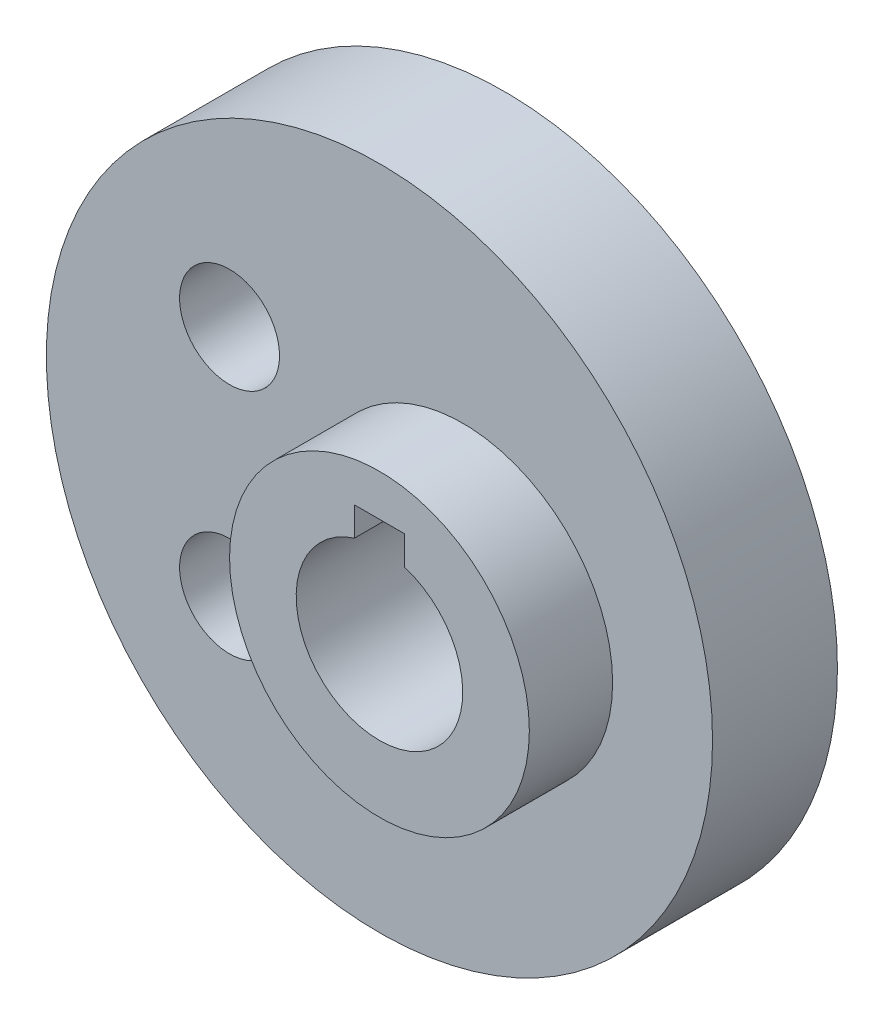
ISO-10303-21;
HEADER;
FILE_DESCRIPTION(('STEP AP214'),'2;1');
FILE_NAME('part.step','',(''),(''),'','','');
FILE_SCHEMA(('AUTOMOTIVE_DESIGN { 1 0 10303 214 1 1 1 1 }'));
ENDSEC;
DATA;
#1=APPLICATION_CONTEXT('core data for automotive mechanical design processes');
#2=APPLICATION_PROTOCOL_DEFINITION('international standard','automotive_design',2000,#1);
#3=PRODUCT_CONTEXT('',#1,'mechanical');
#4=PRODUCT('Part','Part','',(#3));
#5=PRODUCT_RELATED_PRODUCT_CATEGORY('part','',(#4));
#6=PRODUCT_DEFINITION_FORMATION('','',#4);
#7=PRODUCT_DEFINITION_CONTEXT('part definition',#1,'design');
#8=PRODUCT_DEFINITION('design','',#6,#7);
#9=PRODUCT_DEFINITION_SHAPE('','',#8);
#10=(LENGTH_UNIT() NAMED_UNIT(*) SI_UNIT(.MILLI.,.METRE.));
#11=(NAMED_UNIT(*) PLANE_ANGLE_UNIT() SI_UNIT($,.RADIAN.));
#12=(NAMED_UNIT(*) SI_UNIT($,.STERADIAN.) SOLID_ANGLE_UNIT());
#13=UNCERTAINTY_MEASURE_WITH_UNIT(LENGTH_MEASURE(1.E-05),#10,'distance_accuracy_value','');
#14=(GEOMETRIC_REPRESENTATION_CONTEXT(3) GLOBAL_UNCERTAINTY_ASSIGNED_CONTEXT((#13)) GLOBAL_UNIT_ASSIGNED_CONTEXT((#10,
#11,#12)) REPRESENTATION_CONTEXT('',''));
#15=CARTESIAN_POINT('',(0.,0.,0.));
#16=DIRECTION('',(0.,0.,1.));
#17=DIRECTION('',(1.,0.,0.));
#18=AXIS2_PLACEMENT_3D('',#15,#16,#17);
#19=CARTESIAN_POINT('',(0.,0.,15.));
#20=DIRECTION('',(0.,0.,-1.));
#21=DIRECTION('',(-1.,0.,0.));
#22=AXIS2_PLACEMENT_3D('',#19,#20,#21);
#23=CYLINDRICAL_SURFACE('',#22,40.);
#24=CARTESIAN_POINT('',(0.,0.,15.));
#25=DIRECTION('',(0.,0.,1.));
#26=DIRECTION('',(1.,0.,0.));
#27=AXIS2_PLACEMENT_3D('',#24,#25,#26);
#28=CIRCLE('',#27,40.);
#29=CARTESIAN_POINT('',(40.,0.,15.));
#30=VERTEX_POINT('',#29);
#31=EDGE_CURVE('E138',#30,#30,#28,.T.);
#32=ORIENTED_EDGE('',*,*,#31,.F.);
#33=EDGE_LOOP('',(#32));
#34=FACE_BOUND('',#33,.T.);
#35=CARTESIAN_POINT('',(0.,0.,0.));
#36=DIRECTION('',(0.,0.,1.));
#37=DIRECTION('',(1.,0.,0.));
#38=AXIS2_PLACEMENT_3D('',#35,#36,#37);
#39=CIRCLE('',#38,40.);
#40=CARTESIAN_POINT('',(40.,0.,0.));
#41=VERTEX_POINT('',#40);
#42=EDGE_CURVE('E132',#41,#41,#39,.T.);
#43=ORIENTED_EDGE('',*,*,#42,.T.);
#44=EDGE_LOOP('',(#43));
#45=FACE_BOUND('',#44,.T.);
#46=ADVANCED_FACE('F51',(#34,#45),#23,.T.);
#47=CARTESIAN_POINT('',(0.,0.,15.));
#48=DIRECTION('',(0.,0.,1.));
#49=DIRECTION('',(1.,0.,0.));
#50=AXIS2_PLACEMENT_3D('',#47,#48,#49);
#51=PLANE('',#50);
#52=CARTESIAN_POINT('',(-18.,14.,15.));
#53=DIRECTION('',(0.,0.,1.));
#54=DIRECTION('',(1.,0.,0.));
#55=AXIS2_PLACEMENT_3D('',#52,#53,#54);
#56=CIRCLE('',#55,6.);
#57=CARTESIAN_POINT('',(-12.,14.,15.));
#58=VERTEX_POINT('',#57);
#59=EDGE_CURVE('E110',#58,#58,#56,.F.);
#60=ORIENTED_EDGE('',*,*,#59,.T.);
#61=EDGE_LOOP('',(#60));
#62=FACE_BOUND('',#61,.T.);
#63=CARTESIAN_POINT('',(-18.,-14.,15.));
#64=DIRECTION('',(0.,0.,1.));
#65=DIRECTION('',(1.,0.,0.));
#66=AXIS2_PLACEMENT_3D('',#63,#64,#65);
#67=CIRCLE('',#66,6.);
#68=CARTESIAN_POINT('',(-12.,-14.,15.));
#69=VERTEX_POINT('',#68);
#70=EDGE_CURVE('E164',#69,#69,#67,.F.);
#71=ORIENTED_EDGE('',*,*,#70,.T.);
#72=EDGE_LOOP('',(#71));
#73=FACE_BOUND('',#72,.T.);
#74=CARTESIAN_POINT('',(10.,0.,15.));
#75=DIRECTION('',(0.,0.,1.));
#76=DIRECTION('',(1.,0.,0.));
#77=AXIS2_PLACEMENT_3D('',#74,#75,#76);
#78=CIRCLE('',#77,18.);
#79=CARTESIAN_POINT('',(28.,0.,15.));
#80=VERTEX_POINT('',#79);
#81=EDGE_CURVE('E133',#80,#80,#78,.T.);
#82=ORIENTED_EDGE('',*,*,#81,.F.);
#83=EDGE_LOOP('',(#82));
#84=FACE_BOUND('',#83,.T.);
#85=ORIENTED_EDGE('',*,*,#31,.T.);
#86=EDGE_LOOP('',(#85));
#87=FACE_BOUND('',#86,.T.);
#88=ADVANCED_FACE('F190',(#62,#73,#84,#87),#51,.T.);
#89=CARTESIAN_POINT('',(0.,0.,0.));
#90=DIRECTION('',(0.,0.,1.));
#91=DIRECTION('',(1.,0.,0.));
#92=AXIS2_PLACEMENT_3D('',#89,#90,#91);
#93=PLANE('',#92);
#94=CARTESIAN_POINT('',(-18.,14.,0.));
#95=DIRECTION('',(0.,0.,1.));
#96=DIRECTION('',(1.,0.,0.));
#97=AXIS2_PLACEMENT_3D('',#94,#95,#96);
#98=CIRCLE('',#97,6.);
#99=CARTESIAN_POINT('',(-12.,14.,0.));
#100=VERTEX_POINT('',#99);
#101=EDGE_CURVE('E167',#100,#100,#98,.T.);
#102=ORIENTED_EDGE('',*,*,#101,.T.);
#103=EDGE_LOOP('',(#102));
#104=FACE_BOUND('',#103,.T.);
#105=CARTESIAN_POINT('',(-18.,-14.,0.));
#106=DIRECTION('',(0.,0.,1.));
#107=DIRECTION('',(1.,0.,0.));
#108=AXIS2_PLACEMENT_3D('',#105,#106,#107);
#109=CIRCLE('',#108,6.);
#110=CARTESIAN_POINT('',(-12.,-14.,0.));
#111=VERTEX_POINT('',#110);
#112=EDGE_CURVE('E168',#111,#111,#109,.T.);
#113=ORIENTED_EDGE('',*,*,#112,.T.);
#114=EDGE_LOOP('',(#113));
#115=FACE_BOUND('',#114,.T.);
#116=DIRECTION('',(-1.,0.,0.));
#117=VECTOR('',#116,1.);
#118=CARTESIAN_POINT('',(0.,13.,0.));
#119=LINE('',#118,#117);
#120=CARTESIAN_POINT('',(13.,13.,0.));
#121=VERTEX_POINT('',#120);
#122=CARTESIAN_POINT('',(7.,13.,0.));
#123=VERTEX_POINT('',#122);
#124=EDGE_CURVE('E95',#121,#123,#119,.T.);
#125=ORIENTED_EDGE('',*,*,#124,.T.);
#126=DIRECTION('',(0.,-1.,0.));
#127=VECTOR('',#126,1.);
#128=CARTESIAN_POINT('',(7.,0.,0.));
#129=LINE('',#128,#127);
#130=CARTESIAN_POINT('',(7.,9.53939201416946,0.));
#131=VERTEX_POINT('',#130);
#132=EDGE_CURVE('E104',#123,#131,#129,.T.);
#133=ORIENTED_EDGE('',*,*,#132,.T.);
#134=CARTESIAN_POINT('',(10.,0.,0.));
#135=DIRECTION('',(0.,0.,1.));
#136=DIRECTION('',(1.,0.,0.));
#137=AXIS2_PLACEMENT_3D('',#134,#135,#136);
#138=CIRCLE('',#137,10.);
#139=CARTESIAN_POINT('',(13.,9.53939201416946,0.));
#140=VERTEX_POINT('',#139);
#141=EDGE_CURVE('E116',#131,#140,#138,.T.);
#142=ORIENTED_EDGE('',*,*,#141,.T.);
#143=DIRECTION('',(0.,1.,0.));
#144=VECTOR('',#143,1.);
#145=CARTESIAN_POINT('',(13.,0.,0.));
#146=LINE('',#145,#144);
#147=EDGE_CURVE('E67',#140,#121,#146,.T.);
#148=ORIENTED_EDGE('',*,*,#147,.T.);
#149=EDGE_LOOP('',(#125,#133,#142,#148));
#150=FACE_BOUND('',#149,.T.);
#151=ORIENTED_EDGE('',*,*,#42,.F.);
#152=EDGE_LOOP('',(#151));
#153=FACE_BOUND('',#152,.T.);
#154=ADVANCED_FACE('F113',(#104,#115,#150,#153),#93,.F.);
#155=CARTESIAN_POINT('',(10.,0.,25.));
#156=DIRECTION('',(0.,0.,-1.));
#157=DIRECTION('',(-1.,0.,0.));
#158=AXIS2_PLACEMENT_3D('',#155,#156,#157);
#159=CYLINDRICAL_SURFACE('',#158,18.);
#160=CARTESIAN_POINT('',(10.,0.,25.));
#161=DIRECTION('',(0.,0.,1.));
#162=DIRECTION('',(1.,0.,0.));
#163=AXIS2_PLACEMENT_3D('',#160,#161,#162);
#164=CIRCLE('',#163,18.);
#165=CARTESIAN_POINT('',(28.,0.,25.));
#166=VERTEX_POINT('',#165);
#167=EDGE_CURVE('E128',#166,#166,#164,.T.);
#168=ORIENTED_EDGE('',*,*,#167,.F.);
#169=EDGE_LOOP('',(#168));
#170=FACE_BOUND('',#169,.T.);
#171=ORIENTED_EDGE('',*,*,#81,.T.);
#172=EDGE_LOOP('',(#171));
#173=FACE_BOUND('',#172,.T.);
#174=ADVANCED_FACE('F200',(#170,#173),#159,.T.);
#175=CARTESIAN_POINT('',(10.,0.,25.));
#176=DIRECTION('',(0.,0.,1.));
#177=DIRECTION('',(1.,0.,0.));
#178=AXIS2_PLACEMENT_3D('',#175,#176,#177);
#179=PLANE('',#178);
#180=DIRECTION('',(0.,-1.,0.));
#181=VECTOR('',#180,1.);
#182=CARTESIAN_POINT('',(7.,0.,25.));
#183=LINE('',#182,#181);
#184=CARTESIAN_POINT('',(7.,13.,25.));
#185=VERTEX_POINT('',#184);
#186=CARTESIAN_POINT('',(7.,9.53939201416946,25.));
#187=VERTEX_POINT('',#186);
#188=EDGE_CURVE('E75',#185,#187,#183,.T.);
#189=ORIENTED_EDGE('',*,*,#188,.F.);
#190=DIRECTION('',(-1.,0.,0.));
#191=VECTOR('',#190,1.);
#192=CARTESIAN_POINT('',(10.,13.,25.));
#193=LINE('',#192,#191);
#194=CARTESIAN_POINT('',(13.,13.,25.));
#195=VERTEX_POINT('',#194);
#196=EDGE_CURVE('E11',#195,#185,#193,.T.);
#197=ORIENTED_EDGE('',*,*,#196,.F.);
#198=DIRECTION('',(0.,1.,0.));
#199=VECTOR('',#198,1.);
#200=CARTESIAN_POINT('',(13.,0.,25.));
#201=LINE('',#200,#199);
#202=CARTESIAN_POINT('',(13.,9.53939201416946,25.));
#203=VERTEX_POINT('',#202);
#204=EDGE_CURVE('E108',#203,#195,#201,.T.);
#205=ORIENTED_EDGE('',*,*,#204,.F.);
#206=CARTESIAN_POINT('',(10.,0.,25.));
#207=DIRECTION('',(0.,0.,1.));
#208=DIRECTION('',(1.,0.,0.));
#209=AXIS2_PLACEMENT_3D('',#206,#207,#208);
#210=CIRCLE('',#209,10.);
#211=EDGE_CURVE('E103',#187,#203,#210,.T.);
#212=ORIENTED_EDGE('',*,*,#211,.F.);
#213=EDGE_LOOP('',(#189,#197,#205,#212));
#214=FACE_BOUND('',#213,.T.);
#215=ORIENTED_EDGE('',*,*,#167,.T.);
#216=EDGE_LOOP('',(#215));
#217=FACE_BOUND('',#216,.T.);
#218=ADVANCED_FACE('F154',(#214,#217),#179,.T.);
#219=CARTESIAN_POINT('',(10.,0.,-56.));
#220=DIRECTION('',(0.,0.,1.));
#221=DIRECTION('',(1.,0.,0.));
#222=AXIS2_PLACEMENT_3D('',#219,#220,#221);
#223=CYLINDRICAL_SURFACE('',#222,10.);
#224=ORIENTED_EDGE('',*,*,#141,.F.);
#225=DIRECTION('',(0.,0.,1.));
#226=VECTOR('',#225,1.);
#227=CARTESIAN_POINT('',(7.,9.53939201416946,-56.));
#228=LINE('',#227,#226);
#229=EDGE_CURVE('E60',#131,#187,#228,.T.);
#230=ORIENTED_EDGE('',*,*,#229,.T.);
#231=ORIENTED_EDGE('',*,*,#211,.T.);
#232=DIRECTION('',(0.,0.,1.));
#233=VECTOR('',#232,1.);
#234=CARTESIAN_POINT('',(13.,9.53939201416946,-56.));
#235=LINE('',#234,#233);
#236=EDGE_CURVE('E137',#203,#140,#235,.F.);
#237=ORIENTED_EDGE('',*,*,#236,.T.);
#238=EDGE_LOOP('',(#224,#230,#231,#237));
#239=FACE_BOUND('',#238,.T.);
#240=ADVANCED_FACE('F152',(#239),#223,.F.);
#241=CARTESIAN_POINT('',(13.,13.,-56.));
#242=DIRECTION('',(0.,1.,0.));
#243=DIRECTION('',(0.,0.,1.));
#244=AXIS2_PLACEMENT_3D('',#241,#242,#243);
#245=PLANE('',#244);
#246=DIRECTION('',(0.,0.,1.));
#247=VECTOR('',#246,1.);
#248=CARTESIAN_POINT('',(13.,13.,-56.));
#249=LINE('',#248,#247);
#250=EDGE_CURVE('E97',#121,#195,#249,.T.);
#251=ORIENTED_EDGE('',*,*,#250,.T.);
#252=ORIENTED_EDGE('',*,*,#196,.T.);
#253=DIRECTION('',(0.,0.,1.));
#254=VECTOR('',#253,1.);
#255=CARTESIAN_POINT('',(7.,13.,-56.));
#256=LINE('',#255,#254);
#257=EDGE_CURVE('E99',#123,#185,#256,.T.);
#258=ORIENTED_EDGE('',*,*,#257,.F.);
#259=ORIENTED_EDGE('',*,*,#124,.F.);
#260=EDGE_LOOP('',(#251,#252,#258,#259));
#261=FACE_BOUND('',#260,.T.);
#262=ADVANCED_FACE('F96',(#261),#245,.F.);
#263=CARTESIAN_POINT('',(7.,13.,-56.));
#264=DIRECTION('',(-1.,0.,0.));
#265=DIRECTION('',(0.,0.,1.));
#266=AXIS2_PLACEMENT_3D('',#263,#264,#265);
#267=PLANE('',#266);
#268=ORIENTED_EDGE('',*,*,#257,.T.);
#269=ORIENTED_EDGE('',*,*,#188,.T.);
#270=ORIENTED_EDGE('',*,*,#229,.F.);
#271=ORIENTED_EDGE('',*,*,#132,.F.);
#272=EDGE_LOOP('',(#268,#269,#270,#271));
#273=FACE_BOUND('',#272,.T.);
#274=ADVANCED_FACE('F156',(#273),#267,.F.);
#275=CARTESIAN_POINT('',(13.,0.,-56.));
#276=DIRECTION('',(1.,0.,0.));
#277=DIRECTION('',(0.,0.,-1.));
#278=AXIS2_PLACEMENT_3D('',#275,#276,#277);
#279=PLANE('',#278);
#280=ORIENTED_EDGE('',*,*,#236,.F.);
#281=ORIENTED_EDGE('',*,*,#204,.T.);
#282=ORIENTED_EDGE('',*,*,#250,.F.);
#283=ORIENTED_EDGE('',*,*,#147,.F.);
#284=EDGE_LOOP('',(#280,#281,#282,#283));
#285=FACE_BOUND('',#284,.T.);
#286=ADVANCED_FACE('F106',(#285),#279,.F.);
#287=CARTESIAN_POINT('',(-18.,-14.,25.));
#288=DIRECTION('',(0.,0.,-1.));
#289=DIRECTION('',(-1.,0.,0.));
#290=AXIS2_PLACEMENT_3D('',#287,#288,#289);
#291=CYLINDRICAL_SURFACE('',#290,6.);
#292=ORIENTED_EDGE('',*,*,#70,.F.);
#293=EDGE_LOOP('',(#292));
#294=FACE_BOUND('',#293,.T.);
#295=ORIENTED_EDGE('',*,*,#112,.F.);
#296=EDGE_LOOP('',(#295));
#297=FACE_BOUND('',#296,.T.);
#298=ADVANCED_FACE('F180',(#294,#297),#291,.F.);
#299=CARTESIAN_POINT('',(-18.,14.,25.));
#300=DIRECTION('',(0.,0.,-1.));
#301=DIRECTION('',(-1.,0.,0.));
#302=AXIS2_PLACEMENT_3D('',#299,#300,#301);
#303=CYLINDRICAL_SURFACE('',#302,6.);
#304=ORIENTED_EDGE('',*,*,#59,.F.);
#305=EDGE_LOOP('',(#304));
#306=FACE_BOUND('',#305,.T.);
#307=ORIENTED_EDGE('',*,*,#101,.F.);
#308=EDGE_LOOP('',(#307));
#309=FACE_BOUND('',#308,.T.);
#310=ADVANCED_FACE('F178',(#306,#309),#303,.F.);
#311=CLOSED_SHELL('',(#46,#88,#154,#174,#218,#240,#262,#274,#286,#298,#310));
#312=MANIFOLD_SOLID_BREP('B2',#311);
#313=ADVANCED_BREP_SHAPE_REPRESENTATION('',(#18,#312),#14);
#314=SHAPE_DEFINITION_REPRESENTATION(#9,#313);
ENDSEC;
END-ISO-10303-21;
